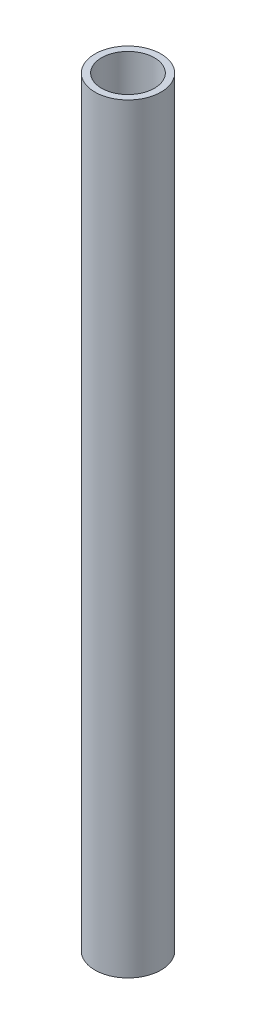
ISO-10303-21;
HEADER;
FILE_DESCRIPTION(('STEP AP214'),'2;1');
FILE_NAME('part.step','',(''),(''),'','','');
FILE_SCHEMA(('AUTOMOTIVE_DESIGN { 1 0 10303 214 1 1 1 1 }'));
ENDSEC;
DATA;
#1=APPLICATION_CONTEXT('core data for automotive mechanical design processes');
#2=APPLICATION_PROTOCOL_DEFINITION('international standard','automotive_design',2000,#1);
#3=PRODUCT_CONTEXT('',#1,'mechanical');
#4=PRODUCT('Part','Part','',(#3));
#5=PRODUCT_RELATED_PRODUCT_CATEGORY('part','',(#4));
#6=PRODUCT_DEFINITION_FORMATION('','',#4);
#7=PRODUCT_DEFINITION_CONTEXT('part definition',#1,'design');
#8=PRODUCT_DEFINITION('design','',#6,#7);
#9=PRODUCT_DEFINITION_SHAPE('','',#8);
#10=(LENGTH_UNIT() NAMED_UNIT(*) SI_UNIT(.MILLI.,.METRE.));
#11=(NAMED_UNIT(*) PLANE_ANGLE_UNIT() SI_UNIT($,.RADIAN.));
#12=(NAMED_UNIT(*) SI_UNIT($,.STERADIAN.) SOLID_ANGLE_UNIT());
#13=UNCERTAINTY_MEASURE_WITH_UNIT(LENGTH_MEASURE(1.E-05),#10,'distance_accuracy_value','');
#14=(GEOMETRIC_REPRESENTATION_CONTEXT(3) GLOBAL_UNCERTAINTY_ASSIGNED_CONTEXT((#13)) GLOBAL_UNIT_ASSIGNED_CONTEXT((#10,
#11,#12)) REPRESENTATION_CONTEXT('',''));
#15=CARTESIAN_POINT('',(0.,0.,0.));
#16=DIRECTION('',(0.,0.,1.));
#17=DIRECTION('',(1.,0.,0.));
#18=AXIS2_PLACEMENT_3D('',#15,#16,#17);
#19=CARTESIAN_POINT('',(0.,115.,0.));
#20=DIRECTION('',(0.,-1.,0.));
#21=DIRECTION('',(0.,0.,-1.));
#22=AXIS2_PLACEMENT_3D('',#19,#20,#21);
#23=CYLINDRICAL_SURFACE('',#22,5.);
#24=CARTESIAN_POINT('',(0.,115.,0.));
#25=DIRECTION('',(0.,1.,0.));
#26=DIRECTION('',(0.,0.,1.));
#27=AXIS2_PLACEMENT_3D('',#24,#25,#26);
#28=CIRCLE('',#27,5.);
#29=CARTESIAN_POINT('',(0.,115.,5.));
#30=VERTEX_POINT('',#29);
#31=EDGE_CURVE('E10',#30,#30,#28,.T.);
#32=ORIENTED_EDGE('',*,*,#31,.F.);
#33=EDGE_LOOP('',(#32));
#34=FACE_BOUND('',#33,.T.);
#35=CARTESIAN_POINT('',(0.,0.,0.));
#36=DIRECTION('',(0.,1.,0.));
#37=DIRECTION('',(0.,0.,1.));
#38=AXIS2_PLACEMENT_3D('',#35,#36,#37);
#39=CIRCLE('',#38,5.);
#40=CARTESIAN_POINT('',(0.,0.,5.));
#41=VERTEX_POINT('',#40);
#42=EDGE_CURVE('E39',#41,#41,#39,.T.);
#43=ORIENTED_EDGE('',*,*,#42,.T.);
#44=EDGE_LOOP('',(#43));
#45=FACE_BOUND('',#44,.T.);
#46=ADVANCED_FACE('F32',(#34,#45),#23,.T.);
#47=CARTESIAN_POINT('',(0.,115.,0.));
#48=DIRECTION('',(0.,1.,0.));
#49=DIRECTION('',(0.,0.,1.));
#50=AXIS2_PLACEMENT_3D('',#47,#48,#49);
#51=PLANE('',#50);
#52=CARTESIAN_POINT('',(0.,115.,0.));
#53=DIRECTION('',(0.,1.,0.));
#54=DIRECTION('',(0.,0.,1.));
#55=AXIS2_PLACEMENT_3D('',#52,#53,#54);
#56=CIRCLE('',#55,4.);
#57=CARTESIAN_POINT('',(0.,115.,4.));
#58=VERTEX_POINT('',#57);
#59=EDGE_CURVE('E45',#58,#58,#56,.T.);
#60=ORIENTED_EDGE('',*,*,#59,.F.);
#61=EDGE_LOOP('',(#60));
#62=FACE_BOUND('',#61,.T.);
#63=ORIENTED_EDGE('',*,*,#31,.T.);
#64=EDGE_LOOP('',(#63));
#65=FACE_BOUND('',#64,.T.);
#66=ADVANCED_FACE('F61',(#62,#65),#51,.T.);
#67=CARTESIAN_POINT('',(0.,0.,0.));
#68=DIRECTION('',(0.,1.,0.));
#69=DIRECTION('',(0.,0.,1.));
#70=AXIS2_PLACEMENT_3D('',#67,#68,#69);
#71=PLANE('',#70);
#72=CARTESIAN_POINT('',(0.,0.,0.));
#73=DIRECTION('',(0.,1.,0.));
#74=DIRECTION('',(0.,0.,1.));
#75=AXIS2_PLACEMENT_3D('',#72,#73,#74);
#76=CIRCLE('',#75,4.);
#77=CARTESIAN_POINT('',(0.,0.,4.));
#78=VERTEX_POINT('',#77);
#79=EDGE_CURVE('E35',#78,#78,#76,.T.);
#80=ORIENTED_EDGE('',*,*,#79,.T.);
#81=EDGE_LOOP('',(#80));
#82=FACE_BOUND('',#81,.T.);
#83=ORIENTED_EDGE('',*,*,#42,.F.);
#84=EDGE_LOOP('',(#83));
#85=FACE_BOUND('',#84,.T.);
#86=ADVANCED_FACE('F52',(#82,#85),#71,.F.);
#87=CARTESIAN_POINT('',(0.,-35.,0.));
#88=DIRECTION('',(0.,1.,0.));
#89=DIRECTION('',(0.,0.,1.));
#90=AXIS2_PLACEMENT_3D('',#87,#88,#89);
#91=CYLINDRICAL_SURFACE('',#90,4.);
#92=ORIENTED_EDGE('',*,*,#59,.T.);
#93=EDGE_LOOP('',(#92));
#94=FACE_BOUND('',#93,.T.);
#95=ORIENTED_EDGE('',*,*,#79,.F.);
#96=EDGE_LOOP('',(#95));
#97=FACE_BOUND('',#96,.T.);
#98=ADVANCED_FACE('F55',(#94,#97),#91,.F.);
#99=CLOSED_SHELL('',(#46,#66,#86,#98));
#100=MANIFOLD_SOLID_BREP('B2',#99);
#101=ADVANCED_BREP_SHAPE_REPRESENTATION('',(#18,#100),#14);
#102=SHAPE_DEFINITION_REPRESENTATION(#9,#101);
ENDSEC;
END-ISO-10303-21;
